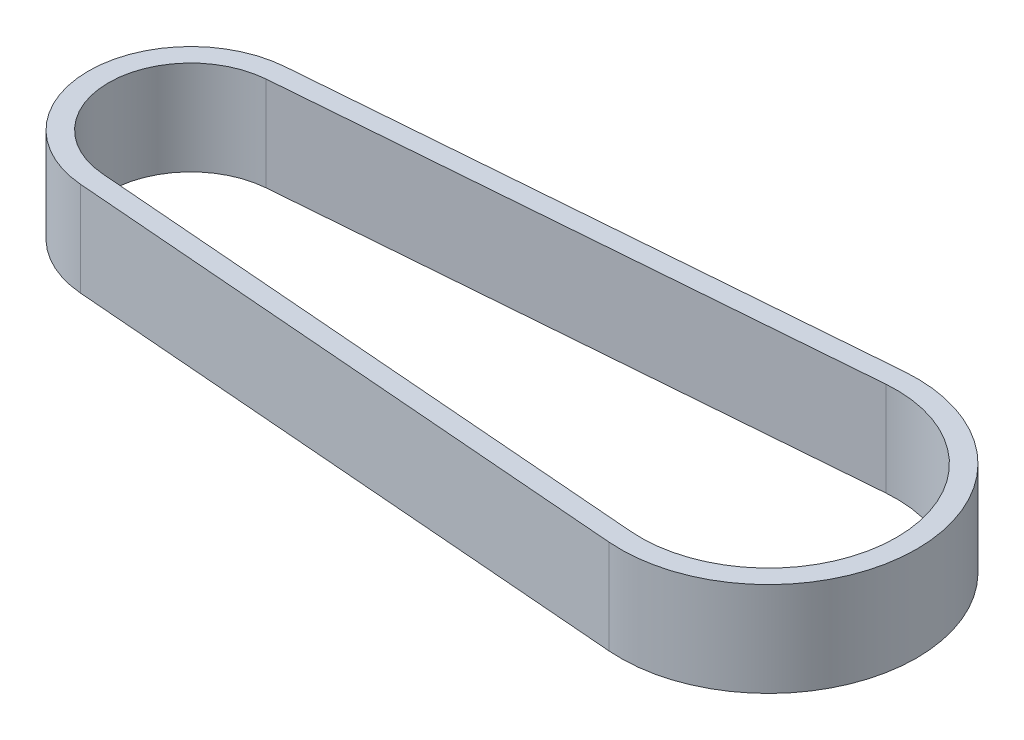
ISO-10303-21;
HEADER;
FILE_DESCRIPTION(('STEP AP214'),'2;1');
FILE_NAME('part.step','',(''),(''),'','','');
FILE_SCHEMA(('AUTOMOTIVE_DESIGN { 1 0 10303 214 1 1 1 1 }'));
ENDSEC;
DATA;
#1=APPLICATION_CONTEXT('core data for automotive mechanical design processes');
#2=APPLICATION_PROTOCOL_DEFINITION('international standard','automotive_design',2000,#1);
#3=PRODUCT_CONTEXT('',#1,'mechanical');
#4=PRODUCT('Part','Part','',(#3));
#5=PRODUCT_RELATED_PRODUCT_CATEGORY('part','',(#4));
#6=PRODUCT_DEFINITION_FORMATION('','',#4);
#7=PRODUCT_DEFINITION_CONTEXT('part definition',#1,'design');
#8=PRODUCT_DEFINITION('design','',#6,#7);
#9=PRODUCT_DEFINITION_SHAPE('','',#8);
#10=(LENGTH_UNIT() NAMED_UNIT(*) SI_UNIT(.MILLI.,.METRE.));
#11=(NAMED_UNIT(*) PLANE_ANGLE_UNIT() SI_UNIT($,.RADIAN.));
#12=(NAMED_UNIT(*) SI_UNIT($,.STERADIAN.) SOLID_ANGLE_UNIT());
#13=UNCERTAINTY_MEASURE_WITH_UNIT(LENGTH_MEASURE(1.E-05),#10,'distance_accuracy_value','');
#14=(GEOMETRIC_REPRESENTATION_CONTEXT(3) GLOBAL_UNCERTAINTY_ASSIGNED_CONTEXT((#13)) GLOBAL_UNIT_ASSIGNED_CONTEXT((#10,
#11,#12)) REPRESENTATION_CONTEXT('',''));
#15=CARTESIAN_POINT('',(0.,0.,0.));
#16=DIRECTION('',(0.,0.,1.));
#17=DIRECTION('',(1.,0.,0.));
#18=AXIS2_PLACEMENT_3D('',#15,#16,#17);
#19=CARTESIAN_POINT('',(0.,7.,0.));
#20=DIRECTION('',(0.,1.,0.));
#21=DIRECTION('',(0.,0.,1.));
#22=AXIS2_PLACEMENT_3D('',#19,#20,#21);
#23=PLANE('',#22);
#24=CARTESIAN_POINT('',(0.,7.,0.));
#25=DIRECTION('',(0.,1.,0.));
#26=DIRECTION('',(0.,0.,1.));
#27=AXIS2_PLACEMENT_3D('',#24,#25,#26);
#28=CIRCLE('',#27,7.6);
#29=CARTESIAN_POINT('',(-0.602331002331004,7.,-7.57609380641706));
#30=VERTEX_POINT('',#29);
#31=CARTESIAN_POINT('',(-0.602331002331003,7.,7.57609380641706));
#32=VERTEX_POINT('',#31);
#33=EDGE_CURVE('E133',#30,#32,#28,.T.);
#34=ORIENTED_EDGE('',*,*,#33,.T.);
#35=DIRECTION('',(0.996854448212771,0.,0.0792540792540792));
#36=VECTOR('',#35,1.);
#37=CARTESIAN_POINT('',(-0.602331002331003,7.,7.57609380641706));
#38=LINE('',#37,#36);
#39=CARTESIAN_POINT('',(42.0282051282051,7.,10.9653989303405));
#40=VERTEX_POINT('',#39);
#41=EDGE_CURVE('E136',#32,#40,#38,.T.);
#42=ORIENTED_EDGE('',*,*,#41,.T.);
#43=CARTESIAN_POINT('',(42.9,7.,0.));
#44=DIRECTION('',(0.,1.,0.));
#45=DIRECTION('',(0.,0.,1.));
#46=AXIS2_PLACEMENT_3D('',#43,#44,#45);
#47=CIRCLE('',#46,11.);
#48=CARTESIAN_POINT('',(42.0282051282051,7.,-10.9653989303405));
#49=VERTEX_POINT('',#48);
#50=EDGE_CURVE('E139',#40,#49,#47,.T.);
#51=ORIENTED_EDGE('',*,*,#50,.T.);
#52=DIRECTION('',(-0.996854448212771,0.,0.0792540792540794));
#53=VECTOR('',#52,1.);
#54=CARTESIAN_POINT('',(-0.602331002331004,7.,-7.57609380641706));
#55=LINE('',#54,#53);
#56=EDGE_CURVE('E141',#49,#30,#55,.T.);
#57=ORIENTED_EDGE('',*,*,#56,.T.);
#58=EDGE_LOOP('',(#34,#42,#51,#57));
#59=FACE_BOUND('',#58,.T.);
#60=DIRECTION('',(0.996854448212771,0.,0.0792540792540793));
#61=VECTOR('',#60,1.);
#62=CARTESIAN_POINT('',(-0.483449883449884,7.,6.08081213409791));
#63=LINE('',#62,#61);
#64=CARTESIAN_POINT('',(-0.483449883449884,7.,6.08081213409791));
#65=VERTEX_POINT('',#64);
#66=CARTESIAN_POINT('',(42.1470862470862,7.,9.47011725802133));
#67=VERTEX_POINT('',#66);
#68=EDGE_CURVE('E105',#65,#67,#63,.T.);
#69=ORIENTED_EDGE('',*,*,#68,.F.);
#70=CARTESIAN_POINT('',(0.,7.,0.));
#71=DIRECTION('',(0.,1.,0.));
#72=DIRECTION('',(0.,0.,1.));
#73=AXIS2_PLACEMENT_3D('',#70,#71,#72);
#74=CIRCLE('',#73,6.1);
#75=CARTESIAN_POINT('',(-0.483449883449884,7.,-6.08081213409791));
#76=VERTEX_POINT('',#75);
#77=EDGE_CURVE('E97',#76,#65,#74,.T.);
#78=ORIENTED_EDGE('',*,*,#77,.F.);
#79=DIRECTION('',(-0.996854448212771,0.,0.0792540792540793));
#80=VECTOR('',#79,1.);
#81=CARTESIAN_POINT('',(-0.483449883449884,7.,-6.08081213409791));
#82=LINE('',#81,#80);
#83=CARTESIAN_POINT('',(42.1470862470863,7.,-9.47011725802133));
#84=VERTEX_POINT('',#83);
#85=EDGE_CURVE('E119',#84,#76,#82,.T.);
#86=ORIENTED_EDGE('',*,*,#85,.F.);
#87=CARTESIAN_POINT('',(42.9,7.,0.));
#88=DIRECTION('',(0.,1.,0.));
#89=DIRECTION('',(0.,0.,1.));
#90=AXIS2_PLACEMENT_3D('',#87,#88,#89);
#91=CIRCLE('',#90,9.50000000000001);
#92=EDGE_CURVE('E117',#67,#84,#91,.T.);
#93=ORIENTED_EDGE('',*,*,#92,.F.);
#94=EDGE_LOOP('',(#69,#78,#86,#93));
#95=FACE_BOUND('',#94,.T.);
#96=ADVANCED_FACE('F32',(#59,#95),#23,.T.);
#97=CARTESIAN_POINT('',(0.,0.,0.));
#98=DIRECTION('',(0.,1.,0.));
#99=DIRECTION('',(0.,0.,1.));
#100=AXIS2_PLACEMENT_3D('',#97,#98,#99);
#101=PLANE('',#100);
#102=CARTESIAN_POINT('',(0.,0.,0.));
#103=DIRECTION('',(0.,1.,0.));
#104=DIRECTION('',(0.,0.,1.));
#105=AXIS2_PLACEMENT_3D('',#102,#103,#104);
#106=CIRCLE('',#105,7.6);
#107=CARTESIAN_POINT('',(-0.602331002331004,0.,-7.57609380641706));
#108=VERTEX_POINT('',#107);
#109=CARTESIAN_POINT('',(-0.602331002331003,0.,7.57609380641706));
#110=VERTEX_POINT('',#109);
#111=EDGE_CURVE('E113',#108,#110,#106,.T.);
#112=ORIENTED_EDGE('',*,*,#111,.F.);
#113=DIRECTION('',(-0.996854448212771,0.,0.0792540792540794));
#114=VECTOR('',#113,1.);
#115=CARTESIAN_POINT('',(-0.602331002331004,0.,-7.57609380641706));
#116=LINE('',#115,#114);
#117=CARTESIAN_POINT('',(42.0282051282051,0.,-10.9653989303405));
#118=VERTEX_POINT('',#117);
#119=EDGE_CURVE('E137',#118,#108,#116,.T.);
#120=ORIENTED_EDGE('',*,*,#119,.F.);
#121=CARTESIAN_POINT('',(42.9,0.,0.));
#122=DIRECTION('',(0.,1.,0.));
#123=DIRECTION('',(0.,0.,1.));
#124=AXIS2_PLACEMENT_3D('',#121,#122,#123);
#125=CIRCLE('',#124,11.);
#126=CARTESIAN_POINT('',(42.0282051282051,0.,10.9653989303405));
#127=VERTEX_POINT('',#126);
#128=EDGE_CURVE('E148',#127,#118,#125,.T.);
#129=ORIENTED_EDGE('',*,*,#128,.F.);
#130=DIRECTION('',(0.996854448212771,0.,0.0792540792540792));
#131=VECTOR('',#130,1.);
#132=CARTESIAN_POINT('',(-0.602331002331003,0.,7.57609380641706));
#133=LINE('',#132,#131);
#134=EDGE_CURVE('E146',#110,#127,#133,.T.);
#135=ORIENTED_EDGE('',*,*,#134,.F.);
#136=EDGE_LOOP('',(#112,#120,#129,#135));
#137=FACE_BOUND('',#136,.T.);
#138=CARTESIAN_POINT('',(0.,0.,0.));
#139=DIRECTION('',(0.,1.,0.));
#140=DIRECTION('',(0.,0.,1.));
#141=AXIS2_PLACEMENT_3D('',#138,#139,#140);
#142=CIRCLE('',#141,6.1);
#143=CARTESIAN_POINT('',(-0.483449883449884,0.,-6.08081213409791));
#144=VERTEX_POINT('',#143);
#145=CARTESIAN_POINT('',(-0.483449883449884,0.,6.08081213409791));
#146=VERTEX_POINT('',#145);
#147=EDGE_CURVE('E55',#144,#146,#142,.T.);
#148=ORIENTED_EDGE('',*,*,#147,.T.);
#149=DIRECTION('',(0.996854448212771,0.,0.0792540792540793));
#150=VECTOR('',#149,1.);
#151=CARTESIAN_POINT('',(-0.483449883449884,0.,6.08081213409791));
#152=LINE('',#151,#150);
#153=CARTESIAN_POINT('',(42.1470862470862,0.,9.47011725802133));
#154=VERTEX_POINT('',#153);
#155=EDGE_CURVE('E112',#146,#154,#152,.T.);
#156=ORIENTED_EDGE('',*,*,#155,.T.);
#157=CARTESIAN_POINT('',(42.9,0.,0.));
#158=DIRECTION('',(0.,1.,0.));
#159=DIRECTION('',(0.,0.,1.));
#160=AXIS2_PLACEMENT_3D('',#157,#158,#159);
#161=CIRCLE('',#160,9.50000000000001);
#162=CARTESIAN_POINT('',(42.1470862470862,0.,-9.47011725802133));
#163=VERTEX_POINT('',#162);
#164=EDGE_CURVE('E125',#154,#163,#161,.T.);
#165=ORIENTED_EDGE('',*,*,#164,.T.);
#166=DIRECTION('',(-0.996854448212771,0.,0.0792540792540793));
#167=VECTOR('',#166,1.);
#168=CARTESIAN_POINT('',(-0.483449883449884,0.,-6.08081213409791));
#169=LINE('',#168,#167);
#170=EDGE_CURVE('E106',#163,#144,#169,.T.);
#171=ORIENTED_EDGE('',*,*,#170,.T.);
#172=EDGE_LOOP('',(#148,#156,#165,#171));
#173=FACE_BOUND('',#172,.T.);
#174=ADVANCED_FACE('F166',(#137,#173),#101,.F.);
#175=CARTESIAN_POINT('',(0.,7.,0.));
#176=DIRECTION('',(0.,-1.,0.));
#177=DIRECTION('',(0.,0.,-1.));
#178=AXIS2_PLACEMENT_3D('',#175,#176,#177);
#179=CYLINDRICAL_SURFACE('',#178,7.6);
#180=ORIENTED_EDGE('',*,*,#111,.T.);
#181=DIRECTION('',(0.,-1.,0.));
#182=VECTOR('',#181,1.);
#183=CARTESIAN_POINT('',(-0.602331002331003,7.,7.57609380641706));
#184=LINE('',#183,#182);
#185=EDGE_CURVE('E11',#32,#110,#184,.T.);
#186=ORIENTED_EDGE('',*,*,#185,.F.);
#187=ORIENTED_EDGE('',*,*,#33,.F.);
#188=DIRECTION('',(0.,-1.,0.));
#189=VECTOR('',#188,1.);
#190=CARTESIAN_POINT('',(-0.602331002331004,7.,-7.57609380641706));
#191=LINE('',#190,#189);
#192=EDGE_CURVE('E143',#30,#108,#191,.T.);
#193=ORIENTED_EDGE('',*,*,#192,.T.);
#194=EDGE_LOOP('',(#180,#186,#187,#193));
#195=FACE_BOUND('',#194,.T.);
#196=ADVANCED_FACE('F34',(#195),#179,.T.);
#197=CARTESIAN_POINT('',(-0.602331002331003,7.,7.57609380641706));
#198=DIRECTION('',(0.0792540792540792,0.,-0.996854448212771));
#199=DIRECTION('',(-0.996854448212771,0.,-0.0792540792540792));
#200=AXIS2_PLACEMENT_3D('',#197,#198,#199);
#201=PLANE('',#200);
#202=ORIENTED_EDGE('',*,*,#134,.T.);
#203=DIRECTION('',(0.,-1.,0.));
#204=VECTOR('',#203,1.);
#205=CARTESIAN_POINT('',(42.0282051282051,7.,10.9653989303405));
#206=LINE('',#205,#204);
#207=EDGE_CURVE('E40',#40,#127,#206,.T.);
#208=ORIENTED_EDGE('',*,*,#207,.F.);
#209=ORIENTED_EDGE('',*,*,#41,.F.);
#210=ORIENTED_EDGE('',*,*,#185,.T.);
#211=EDGE_LOOP('',(#202,#208,#209,#210));
#212=FACE_BOUND('',#211,.T.);
#213=ADVANCED_FACE('F176',(#212),#201,.F.);
#214=CARTESIAN_POINT('',(42.9,7.,0.));
#215=DIRECTION('',(0.,-1.,0.));
#216=DIRECTION('',(0.,0.,-1.));
#217=AXIS2_PLACEMENT_3D('',#214,#215,#216);
#218=CYLINDRICAL_SURFACE('',#217,11.);
#219=ORIENTED_EDGE('',*,*,#128,.T.);
#220=DIRECTION('',(0.,-1.,0.));
#221=VECTOR('',#220,1.);
#222=CARTESIAN_POINT('',(42.0282051282051,7.,-10.9653989303405));
#223=LINE('',#222,#221);
#224=EDGE_CURVE('E153',#49,#118,#223,.T.);
#225=ORIENTED_EDGE('',*,*,#224,.F.);
#226=ORIENTED_EDGE('',*,*,#50,.F.);
#227=ORIENTED_EDGE('',*,*,#207,.T.);
#228=EDGE_LOOP('',(#219,#225,#226,#227));
#229=FACE_BOUND('',#228,.T.);
#230=ADVANCED_FACE('F160',(#229),#218,.T.);
#231=CARTESIAN_POINT('',(-0.602331002331004,7.,-7.57609380641706));
#232=DIRECTION('',(0.0792540792540794,0.,0.996854448212771));
#233=DIRECTION('',(0.996854448212771,0.,-0.0792540792540794));
#234=AXIS2_PLACEMENT_3D('',#231,#232,#233);
#235=PLANE('',#234);
#236=ORIENTED_EDGE('',*,*,#119,.T.);
#237=ORIENTED_EDGE('',*,*,#192,.F.);
#238=ORIENTED_EDGE('',*,*,#56,.F.);
#239=ORIENTED_EDGE('',*,*,#224,.T.);
#240=EDGE_LOOP('',(#236,#237,#238,#239));
#241=FACE_BOUND('',#240,.T.);
#242=ADVANCED_FACE('F170',(#241),#235,.F.);
#243=CARTESIAN_POINT('',(0.,7.,0.));
#244=DIRECTION('',(0.,-1.,0.));
#245=DIRECTION('',(0.,0.,-1.));
#246=AXIS2_PLACEMENT_3D('',#243,#244,#245);
#247=CYLINDRICAL_SURFACE('',#246,6.1);
#248=ORIENTED_EDGE('',*,*,#147,.F.);
#249=DIRECTION('',(0.,-1.,0.));
#250=VECTOR('',#249,1.);
#251=CARTESIAN_POINT('',(-0.483449883449884,7.,-6.08081213409791));
#252=LINE('',#251,#250);
#253=EDGE_CURVE('E101',#76,#144,#252,.T.);
#254=ORIENTED_EDGE('',*,*,#253,.F.);
#255=ORIENTED_EDGE('',*,*,#77,.T.);
#256=DIRECTION('',(0.,-1.,0.));
#257=VECTOR('',#256,1.);
#258=CARTESIAN_POINT('',(-0.483449883449884,7.,6.08081213409791));
#259=LINE('',#258,#257);
#260=EDGE_CURVE('E100',#65,#146,#259,.T.);
#261=ORIENTED_EDGE('',*,*,#260,.T.);
#262=EDGE_LOOP('',(#248,#254,#255,#261));
#263=FACE_BOUND('',#262,.T.);
#264=ADVANCED_FACE('F99',(#263),#247,.F.);
#265=CARTESIAN_POINT('',(-0.483449883449884,7.,6.08081213409791));
#266=DIRECTION('',(0.0792540792540793,0.,-0.996854448212771));
#267=DIRECTION('',(-0.996854448212771,0.,-0.0792540792540793));
#268=AXIS2_PLACEMENT_3D('',#265,#266,#267);
#269=PLANE('',#268);
#270=ORIENTED_EDGE('',*,*,#155,.F.);
#271=ORIENTED_EDGE('',*,*,#260,.F.);
#272=ORIENTED_EDGE('',*,*,#68,.T.);
#273=DIRECTION('',(0.,-1.,0.));
#274=VECTOR('',#273,1.);
#275=CARTESIAN_POINT('',(42.1470862470862,7.,9.47011725802133));
#276=LINE('',#275,#274);
#277=EDGE_CURVE('E114',#67,#154,#276,.T.);
#278=ORIENTED_EDGE('',*,*,#277,.T.);
#279=EDGE_LOOP('',(#270,#271,#272,#278));
#280=FACE_BOUND('',#279,.T.);
#281=ADVANCED_FACE('F109',(#280),#269,.T.);
#282=CARTESIAN_POINT('',(42.9,7.,0.));
#283=DIRECTION('',(0.,-1.,0.));
#284=DIRECTION('',(0.,0.,-1.));
#285=AXIS2_PLACEMENT_3D('',#282,#283,#284);
#286=CYLINDRICAL_SURFACE('',#285,9.50000000000001);
#287=ORIENTED_EDGE('',*,*,#164,.F.);
#288=ORIENTED_EDGE('',*,*,#277,.F.);
#289=ORIENTED_EDGE('',*,*,#92,.T.);
#290=DIRECTION('',(0.,-1.,0.));
#291=VECTOR('',#290,1.);
#292=CARTESIAN_POINT('',(42.1470862470862,7.,-9.47011725802133));
#293=LINE('',#292,#291);
#294=EDGE_CURVE('E47',#84,#163,#293,.T.);
#295=ORIENTED_EDGE('',*,*,#294,.T.);
#296=EDGE_LOOP('',(#287,#288,#289,#295));
#297=FACE_BOUND('',#296,.T.);
#298=ADVANCED_FACE('F199',(#297),#286,.F.);
#299=CARTESIAN_POINT('',(-0.483449883449884,7.,-6.08081213409791));
#300=DIRECTION('',(0.0792540792540793,0.,0.996854448212771));
#301=DIRECTION('',(0.996854448212771,0.,-0.0792540792540793));
#302=AXIS2_PLACEMENT_3D('',#299,#300,#301);
#303=PLANE('',#302);
#304=ORIENTED_EDGE('',*,*,#170,.F.);
#305=ORIENTED_EDGE('',*,*,#294,.F.);
#306=ORIENTED_EDGE('',*,*,#85,.T.);
#307=ORIENTED_EDGE('',*,*,#253,.T.);
#308=EDGE_LOOP('',(#304,#305,#306,#307));
#309=FACE_BOUND('',#308,.T.);
#310=ADVANCED_FACE('F203',(#309),#303,.T.);
#311=CLOSED_SHELL('',(#96,#174,#196,#213,#230,#242,#264,#281,#298,#310));
#312=MANIFOLD_SOLID_BREP('B2',#311);
#313=ADVANCED_BREP_SHAPE_REPRESENTATION('',(#18,#312),#14);
#314=SHAPE_DEFINITION_REPRESENTATION(#9,#313);
ENDSEC;
END-ISO-10303-21;
